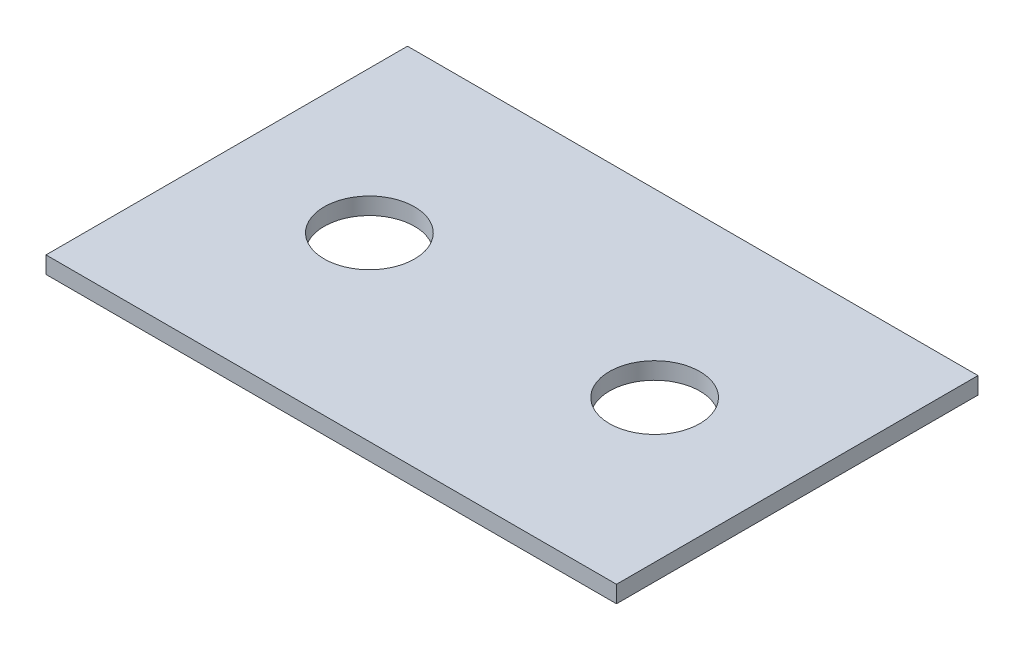
ISO-10303-21;
HEADER;
FILE_DESCRIPTION(('STEP AP214'),'2;1');
FILE_NAME('part.step','',(''),(''),'','','');
FILE_SCHEMA(('AUTOMOTIVE_DESIGN { 1 0 10303 214 1 1 1 1 }'));
ENDSEC;
DATA;
#1=APPLICATION_CONTEXT('core data for automotive mechanical design processes');
#2=APPLICATION_PROTOCOL_DEFINITION('international standard','automotive_design',2000,#1);
#3=PRODUCT_CONTEXT('',#1,'mechanical');
#4=PRODUCT('Part','Part','',(#3));
#5=PRODUCT_RELATED_PRODUCT_CATEGORY('part','',(#4));
#6=PRODUCT_DEFINITION_FORMATION('','',#4);
#7=PRODUCT_DEFINITION_CONTEXT('part definition',#1,'design');
#8=PRODUCT_DEFINITION('design','',#6,#7);
#9=PRODUCT_DEFINITION_SHAPE('','',#8);
#10=(LENGTH_UNIT() NAMED_UNIT(*) SI_UNIT(.MILLI.,.METRE.));
#11=(NAMED_UNIT(*) PLANE_ANGLE_UNIT() SI_UNIT($,.RADIAN.));
#12=(NAMED_UNIT(*) SI_UNIT($,.STERADIAN.) SOLID_ANGLE_UNIT());
#13=UNCERTAINTY_MEASURE_WITH_UNIT(LENGTH_MEASURE(1.E-05),#10,'distance_accuracy_value','');
#14=(GEOMETRIC_REPRESENTATION_CONTEXT(3) GLOBAL_UNCERTAINTY_ASSIGNED_CONTEXT((#13)) GLOBAL_UNIT_ASSIGNED_CONTEXT((#10,
#11,#12)) REPRESENTATION_CONTEXT('',''));
#15=CARTESIAN_POINT('',(0.,0.,0.));
#16=DIRECTION('',(0.,0.,1.));
#17=DIRECTION('',(1.,0.,0.));
#18=AXIS2_PLACEMENT_3D('',#15,#16,#17);
#19=CARTESIAN_POINT('',(0.,3.,0.));
#20=DIRECTION('',(0.,-1.,0.));
#21=DIRECTION('',(0.,0.,-1.));
#22=AXIS2_PLACEMENT_3D('',#19,#20,#21);
#23=PLANE('',#22);
#24=CARTESIAN_POINT('',(-25.25,3.,0.));
#25=DIRECTION('',(0.,1.,0.));
#26=DIRECTION('',(0.,0.,1.));
#27=AXIS2_PLACEMENT_3D('',#24,#25,#26);
#28=CIRCLE('',#27,8.);
#29=CARTESIAN_POINT('',(-25.25,3.,8.));
#30=VERTEX_POINT('',#29);
#31=EDGE_CURVE('E100',#30,#30,#28,.T.);
#32=ORIENTED_EDGE('',*,*,#31,.F.);
#33=EDGE_LOOP('',(#32));
#34=FACE_BOUND('',#33,.T.);
#35=DIRECTION('',(0.,0.,-1.));
#36=VECTOR('',#35,1.);
#37=CARTESIAN_POINT('',(50.5,3.,32.));
#38=LINE('',#37,#36);
#39=CARTESIAN_POINT('',(50.5,3.,32.));
#40=VERTEX_POINT('',#39);
#41=CARTESIAN_POINT('',(50.5,3.,-32.));
#42=VERTEX_POINT('',#41);
#43=EDGE_CURVE('E85',#40,#42,#38,.T.);
#44=ORIENTED_EDGE('',*,*,#43,.T.);
#45=DIRECTION('',(-1.,0.,0.));
#46=VECTOR('',#45,1.);
#47=CARTESIAN_POINT('',(-50.5,3.,-32.));
#48=LINE('',#47,#46);
#49=CARTESIAN_POINT('',(-50.5,3.,-32.));
#50=VERTEX_POINT('',#49);
#51=EDGE_CURVE('E80',#42,#50,#48,.T.);
#52=ORIENTED_EDGE('',*,*,#51,.T.);
#53=DIRECTION('',(0.,0.,1.));
#54=VECTOR('',#53,1.);
#55=CARTESIAN_POINT('',(-50.5,3.,32.));
#56=LINE('',#55,#54);
#57=CARTESIAN_POINT('',(-50.5,3.,32.));
#58=VERTEX_POINT('',#57);
#59=EDGE_CURVE('E83',#50,#58,#56,.T.);
#60=ORIENTED_EDGE('',*,*,#59,.T.);
#61=DIRECTION('',(1.,0.,0.));
#62=VECTOR('',#61,1.);
#63=CARTESIAN_POINT('',(-50.5,3.,32.));
#64=LINE('',#63,#62);
#65=EDGE_CURVE('E50',#58,#40,#64,.T.);
#66=ORIENTED_EDGE('',*,*,#65,.T.);
#67=EDGE_LOOP('',(#44,#52,#60,#66));
#68=FACE_BOUND('',#67,.T.);
#69=CARTESIAN_POINT('',(25.25,3.,0.));
#70=DIRECTION('',(0.,1.,0.));
#71=DIRECTION('',(0.,0.,1.));
#72=AXIS2_PLACEMENT_3D('',#69,#70,#71);
#73=CIRCLE('',#72,8.);
#74=CARTESIAN_POINT('',(25.25,3.,8.));
#75=VERTEX_POINT('',#74);
#76=EDGE_CURVE('E115',#75,#75,#73,.T.);
#77=ORIENTED_EDGE('',*,*,#76,.F.);
#78=EDGE_LOOP('',(#77));
#79=FACE_BOUND('',#78,.T.);
#80=ADVANCED_FACE('F33',(#34,#68,#79),#23,.F.);
#81=CARTESIAN_POINT('',(0.,0.,0.));
#82=DIRECTION('',(0.,-1.,0.));
#83=DIRECTION('',(0.,0.,-1.));
#84=AXIS2_PLACEMENT_3D('',#81,#82,#83);
#85=PLANE('',#84);
#86=CARTESIAN_POINT('',(-25.25,0.,0.));
#87=DIRECTION('',(0.,1.,0.));
#88=DIRECTION('',(0.,0.,1.));
#89=AXIS2_PLACEMENT_3D('',#86,#87,#88);
#90=CIRCLE('',#89,8.);
#91=CARTESIAN_POINT('',(-25.25,0.,8.));
#92=VERTEX_POINT('',#91);
#93=EDGE_CURVE('E112',#92,#92,#90,.T.);
#94=ORIENTED_EDGE('',*,*,#93,.T.);
#95=EDGE_LOOP('',(#94));
#96=FACE_BOUND('',#95,.T.);
#97=DIRECTION('',(0.,0.,-1.));
#98=VECTOR('',#97,1.);
#99=CARTESIAN_POINT('',(50.5,0.,32.));
#100=LINE('',#99,#98);
#101=CARTESIAN_POINT('',(50.5,0.,32.));
#102=VERTEX_POINT('',#101);
#103=CARTESIAN_POINT('',(50.5,0.,-32.));
#104=VERTEX_POINT('',#103);
#105=EDGE_CURVE('E97',#102,#104,#100,.T.);
#106=ORIENTED_EDGE('',*,*,#105,.F.);
#107=DIRECTION('',(1.,0.,0.));
#108=VECTOR('',#107,1.);
#109=CARTESIAN_POINT('',(-50.5,0.,32.));
#110=LINE('',#109,#108);
#111=CARTESIAN_POINT('',(-50.5,0.,32.));
#112=VERTEX_POINT('',#111);
#113=EDGE_CURVE('E73',#112,#102,#110,.T.);
#114=ORIENTED_EDGE('',*,*,#113,.F.);
#115=DIRECTION('',(0.,0.,1.));
#116=VECTOR('',#115,1.);
#117=CARTESIAN_POINT('',(-50.5,0.,32.));
#118=LINE('',#117,#116);
#119=CARTESIAN_POINT('',(-50.5,0.,-32.));
#120=VERTEX_POINT('',#119);
#121=EDGE_CURVE('E67',#120,#112,#118,.T.);
#122=ORIENTED_EDGE('',*,*,#121,.F.);
#123=DIRECTION('',(-1.,0.,0.));
#124=VECTOR('',#123,1.);
#125=CARTESIAN_POINT('',(-50.5,0.,-32.));
#126=LINE('',#125,#124);
#127=EDGE_CURVE('E89',#104,#120,#126,.T.);
#128=ORIENTED_EDGE('',*,*,#127,.F.);
#129=EDGE_LOOP('',(#106,#114,#122,#128));
#130=FACE_BOUND('',#129,.T.);
#131=CARTESIAN_POINT('',(25.25,0.,0.));
#132=DIRECTION('',(0.,1.,0.));
#133=DIRECTION('',(0.,0.,1.));
#134=AXIS2_PLACEMENT_3D('',#131,#132,#133);
#135=CIRCLE('',#134,8.);
#136=CARTESIAN_POINT('',(25.25,0.,8.));
#137=VERTEX_POINT('',#136);
#138=EDGE_CURVE('E118',#137,#137,#135,.T.);
#139=ORIENTED_EDGE('',*,*,#138,.T.);
#140=EDGE_LOOP('',(#139));
#141=FACE_BOUND('',#140,.T.);
#142=ADVANCED_FACE('F108',(#96,#130,#141),#85,.T.);
#143=CARTESIAN_POINT('',(50.5,3.,32.));
#144=DIRECTION('',(-1.,0.,0.));
#145=DIRECTION('',(0.,0.,1.));
#146=AXIS2_PLACEMENT_3D('',#143,#144,#145);
#147=PLANE('',#146);
#148=ORIENTED_EDGE('',*,*,#105,.T.);
#149=DIRECTION('',(0.,-1.,0.));
#150=VECTOR('',#149,1.);
#151=CARTESIAN_POINT('',(50.5,3.,-32.));
#152=LINE('',#151,#150);
#153=EDGE_CURVE('E11',#42,#104,#152,.T.);
#154=ORIENTED_EDGE('',*,*,#153,.F.);
#155=ORIENTED_EDGE('',*,*,#43,.F.);
#156=DIRECTION('',(0.,-1.,0.));
#157=VECTOR('',#156,1.);
#158=CARTESIAN_POINT('',(50.5,3.,32.));
#159=LINE('',#158,#157);
#160=EDGE_CURVE('E93',#40,#102,#159,.T.);
#161=ORIENTED_EDGE('',*,*,#160,.T.);
#162=EDGE_LOOP('',(#148,#154,#155,#161));
#163=FACE_BOUND('',#162,.T.);
#164=ADVANCED_FACE('F35',(#163),#147,.F.);
#165=CARTESIAN_POINT('',(-50.5,3.,-32.));
#166=DIRECTION('',(0.,0.,1.));
#167=DIRECTION('',(1.,0.,0.));
#168=AXIS2_PLACEMENT_3D('',#165,#166,#167);
#169=PLANE('',#168);
#170=ORIENTED_EDGE('',*,*,#127,.T.);
#171=DIRECTION('',(0.,-1.,0.));
#172=VECTOR('',#171,1.);
#173=CARTESIAN_POINT('',(-50.5,3.,-32.));
#174=LINE('',#173,#172);
#175=EDGE_CURVE('E42',#50,#120,#174,.T.);
#176=ORIENTED_EDGE('',*,*,#175,.F.);
#177=ORIENTED_EDGE('',*,*,#51,.F.);
#178=ORIENTED_EDGE('',*,*,#153,.T.);
#179=EDGE_LOOP('',(#170,#176,#177,#178));
#180=FACE_BOUND('',#179,.T.);
#181=ADVANCED_FACE('F88',(#180),#169,.F.);
#182=CARTESIAN_POINT('',(-50.5,3.,32.));
#183=DIRECTION('',(1.,0.,0.));
#184=DIRECTION('',(0.,0.,-1.));
#185=AXIS2_PLACEMENT_3D('',#182,#183,#184);
#186=PLANE('',#185);
#187=ORIENTED_EDGE('',*,*,#121,.T.);
#188=DIRECTION('',(0.,-1.,0.));
#189=VECTOR('',#188,1.);
#190=CARTESIAN_POINT('',(-50.5,3.,32.));
#191=LINE('',#190,#189);
#192=EDGE_CURVE('E90',#58,#112,#191,.T.);
#193=ORIENTED_EDGE('',*,*,#192,.F.);
#194=ORIENTED_EDGE('',*,*,#59,.F.);
#195=ORIENTED_EDGE('',*,*,#175,.T.);
#196=EDGE_LOOP('',(#187,#193,#194,#195));
#197=FACE_BOUND('',#196,.T.);
#198=ADVANCED_FACE('F91',(#197),#186,.F.);
#199=CARTESIAN_POINT('',(-50.5,3.,32.));
#200=DIRECTION('',(0.,0.,-1.));
#201=DIRECTION('',(-1.,0.,0.));
#202=AXIS2_PLACEMENT_3D('',#199,#200,#201);
#203=PLANE('',#202);
#204=ORIENTED_EDGE('',*,*,#113,.T.);
#205=ORIENTED_EDGE('',*,*,#160,.F.);
#206=ORIENTED_EDGE('',*,*,#65,.F.);
#207=ORIENTED_EDGE('',*,*,#192,.T.);
#208=EDGE_LOOP('',(#204,#205,#206,#207));
#209=FACE_BOUND('',#208,.T.);
#210=ADVANCED_FACE('F105',(#209),#203,.F.);
#211=CARTESIAN_POINT('',(-25.25,3.,0.));
#212=DIRECTION('',(0.,-1.,0.));
#213=DIRECTION('',(0.,0.,-1.));
#214=AXIS2_PLACEMENT_3D('',#211,#212,#213);
#215=CYLINDRICAL_SURFACE('',#214,8.);
#216=ORIENTED_EDGE('',*,*,#31,.T.);
#217=EDGE_LOOP('',(#216));
#218=FACE_BOUND('',#217,.T.);
#219=ORIENTED_EDGE('',*,*,#93,.F.);
#220=EDGE_LOOP('',(#219));
#221=FACE_BOUND('',#220,.T.);
#222=ADVANCED_FACE('F136',(#218,#221),#215,.F.);
#223=CARTESIAN_POINT('',(25.25,3.,0.));
#224=DIRECTION('',(0.,-1.,0.));
#225=DIRECTION('',(0.,0.,-1.));
#226=AXIS2_PLACEMENT_3D('',#223,#224,#225);
#227=CYLINDRICAL_SURFACE('',#226,8.);
#228=ORIENTED_EDGE('',*,*,#76,.T.);
#229=EDGE_LOOP('',(#228));
#230=FACE_BOUND('',#229,.T.);
#231=ORIENTED_EDGE('',*,*,#138,.F.);
#232=EDGE_LOOP('',(#231));
#233=FACE_BOUND('',#232,.T.);
#234=ADVANCED_FACE('F124',(#230,#233),#227,.F.);
#235=CLOSED_SHELL('',(#80,#142,#164,#181,#198,#210,#222,#234));
#236=MANIFOLD_SOLID_BREP('B2',#235);
#237=ADVANCED_BREP_SHAPE_REPRESENTATION('',(#18,#236),#14);
#238=SHAPE_DEFINITION_REPRESENTATION(#9,#237);
ENDSEC;
END-ISO-10303-21;
